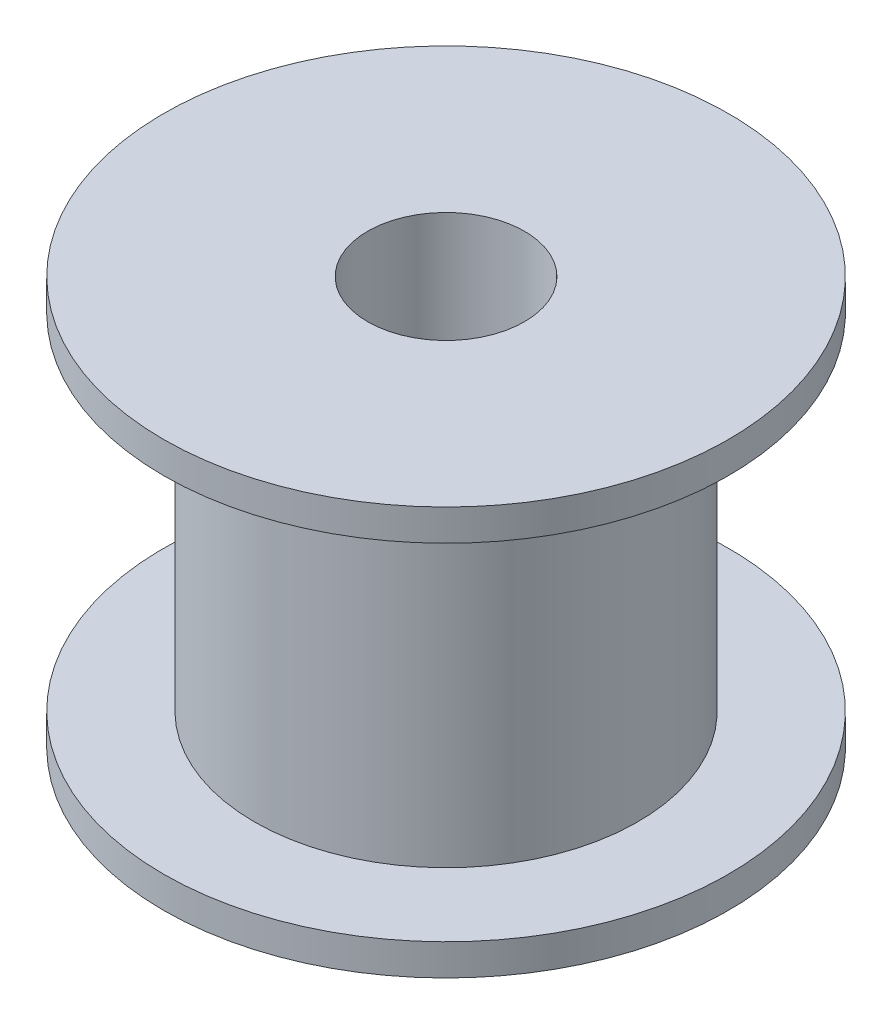
ISO-10303-21;
HEADER;
FILE_DESCRIPTION(('STEP AP214'),'2;1');
FILE_NAME('part.step','',(''),(''),'','','');
FILE_SCHEMA(('AUTOMOTIVE_DESIGN { 1 0 10303 214 1 1 1 1 }'));
ENDSEC;
DATA;
#1=APPLICATION_CONTEXT('core data for automotive mechanical design processes');
#2=APPLICATION_PROTOCOL_DEFINITION('international standard','automotive_design',2000,#1);
#3=PRODUCT_CONTEXT('',#1,'mechanical');
#4=PRODUCT('Part','Part','',(#3));
#5=PRODUCT_RELATED_PRODUCT_CATEGORY('part','',(#4));
#6=PRODUCT_DEFINITION_FORMATION('','',#4);
#7=PRODUCT_DEFINITION_CONTEXT('part definition',#1,'design');
#8=PRODUCT_DEFINITION('design','',#6,#7);
#9=PRODUCT_DEFINITION_SHAPE('','',#8);
#10=(LENGTH_UNIT() NAMED_UNIT(*) SI_UNIT(.MILLI.,.METRE.));
#11=(NAMED_UNIT(*) PLANE_ANGLE_UNIT() SI_UNIT($,.RADIAN.));
#12=(NAMED_UNIT(*) SI_UNIT($,.STERADIAN.) SOLID_ANGLE_UNIT());
#13=UNCERTAINTY_MEASURE_WITH_UNIT(LENGTH_MEASURE(1.E-05),#10,'distance_accuracy_value','');
#14=(GEOMETRIC_REPRESENTATION_CONTEXT(3) GLOBAL_UNCERTAINTY_ASSIGNED_CONTEXT((#13)) GLOBAL_UNIT_ASSIGNED_CONTEXT((#10,
#11,#12)) REPRESENTATION_CONTEXT('',''));
#15=CARTESIAN_POINT('',(0.,0.,0.));
#16=DIRECTION('',(0.,0.,1.));
#17=DIRECTION('',(1.,0.,0.));
#18=AXIS2_PLACEMENT_3D('',#15,#16,#17);
#19=CARTESIAN_POINT('',(0.,1.,0.));
#20=DIRECTION('',(0.,-1.,0.));
#21=DIRECTION('',(0.,0.,-1.));
#22=AXIS2_PLACEMENT_3D('',#19,#20,#21);
#23=CYLINDRICAL_SURFACE('',#22,9.);
#24=CARTESIAN_POINT('',(0.,1.,0.));
#25=DIRECTION('',(0.,1.,0.));
#26=DIRECTION('',(0.,0.,1.));
#27=AXIS2_PLACEMENT_3D('',#24,#25,#26);
#28=CIRCLE('',#27,9.);
#29=CARTESIAN_POINT('',(0.,1.,9.));
#30=VERTEX_POINT('',#29);
#31=EDGE_CURVE('E46',#30,#30,#28,.T.);
#32=ORIENTED_EDGE('',*,*,#31,.F.);
#33=EDGE_LOOP('',(#32));
#34=FACE_BOUND('',#33,.T.);
#35=CARTESIAN_POINT('',(0.,0.,0.));
#36=DIRECTION('',(0.,1.,0.));
#37=DIRECTION('',(0.,0.,1.));
#38=AXIS2_PLACEMENT_3D('',#35,#36,#37);
#39=CIRCLE('',#38,9.);
#40=CARTESIAN_POINT('',(0.,0.,9.));
#41=VERTEX_POINT('',#40);
#42=EDGE_CURVE('E42',#41,#41,#39,.T.);
#43=ORIENTED_EDGE('',*,*,#42,.T.);
#44=EDGE_LOOP('',(#43));
#45=FACE_BOUND('',#44,.T.);
#46=ADVANCED_FACE('F39',(#34,#45),#23,.T.);
#47=CARTESIAN_POINT('',(0.,1.,0.));
#48=DIRECTION('',(0.,1.,0.));
#49=DIRECTION('',(0.,0.,1.));
#50=AXIS2_PLACEMENT_3D('',#47,#48,#49);
#51=PLANE('',#50);
#52=CARTESIAN_POINT('',(0.,1.,0.));
#53=DIRECTION('',(0.,1.,0.));
#54=DIRECTION('',(0.,0.,1.));
#55=AXIS2_PLACEMENT_3D('',#52,#53,#54);
#56=CIRCLE('',#55,6.11);
#57=CARTESIAN_POINT('',(0.,1.,6.11));
#58=VERTEX_POINT('',#57);
#59=EDGE_CURVE('E10',#58,#58,#56,.T.);
#60=ORIENTED_EDGE('',*,*,#59,.F.);
#61=EDGE_LOOP('',(#60));
#62=FACE_BOUND('',#61,.T.);
#63=ORIENTED_EDGE('',*,*,#31,.T.);
#64=EDGE_LOOP('',(#63));
#65=FACE_BOUND('',#64,.T.);
#66=ADVANCED_FACE('F98',(#62,#65),#51,.T.);
#67=CARTESIAN_POINT('',(0.,0.,0.));
#68=DIRECTION('',(0.,1.,0.));
#69=DIRECTION('',(0.,0.,1.));
#70=AXIS2_PLACEMENT_3D('',#67,#68,#69);
#71=PLANE('',#70);
#72=CARTESIAN_POINT('',(0.,0.,0.));
#73=DIRECTION('',(0.,1.,0.));
#74=DIRECTION('',(0.,0.,1.));
#75=AXIS2_PLACEMENT_3D('',#72,#73,#74);
#76=CIRCLE('',#75,2.5);
#77=CARTESIAN_POINT('',(0.,0.,2.5));
#78=VERTEX_POINT('',#77);
#79=EDGE_CURVE('E59',#78,#78,#76,.T.);
#80=ORIENTED_EDGE('',*,*,#79,.T.);
#81=EDGE_LOOP('',(#80));
#82=FACE_BOUND('',#81,.T.);
#83=ORIENTED_EDGE('',*,*,#42,.F.);
#84=EDGE_LOOP('',(#83));
#85=FACE_BOUND('',#84,.T.);
#86=ADVANCED_FACE('F68',(#82,#85),#71,.F.);
#87=CARTESIAN_POINT('',(0.,12.,0.));
#88=DIRECTION('',(0.,-1.,0.));
#89=DIRECTION('',(0.,0.,-1.));
#90=AXIS2_PLACEMENT_3D('',#87,#88,#89);
#91=CYLINDRICAL_SURFACE('',#90,6.11);
#92=CARTESIAN_POINT('',(0.,12.,0.));
#93=DIRECTION('',(0.,1.,0.));
#94=DIRECTION('',(0.,0.,1.));
#95=AXIS2_PLACEMENT_3D('',#92,#93,#94);
#96=CIRCLE('',#95,6.11);
#97=CARTESIAN_POINT('',(0.,12.,6.11));
#98=VERTEX_POINT('',#97);
#99=EDGE_CURVE('E52',#98,#98,#96,.T.);
#100=ORIENTED_EDGE('',*,*,#99,.F.);
#101=EDGE_LOOP('',(#100));
#102=FACE_BOUND('',#101,.T.);
#103=ORIENTED_EDGE('',*,*,#59,.T.);
#104=EDGE_LOOP('',(#103));
#105=FACE_BOUND('',#104,.T.);
#106=ADVANCED_FACE('F87',(#102,#105),#91,.T.);
#107=CARTESIAN_POINT('',(0.,13.,0.));
#108=DIRECTION('',(0.,-1.,0.));
#109=DIRECTION('',(0.,0.,-1.));
#110=AXIS2_PLACEMENT_3D('',#107,#108,#109);
#111=CYLINDRICAL_SURFACE('',#110,9.);
#112=CARTESIAN_POINT('',(0.,13.,0.));
#113=DIRECTION('',(0.,1.,0.));
#114=DIRECTION('',(0.,0.,1.));
#115=AXIS2_PLACEMENT_3D('',#112,#113,#114);
#116=CIRCLE('',#115,9.);
#117=CARTESIAN_POINT('',(0.,13.,9.));
#118=VERTEX_POINT('',#117);
#119=EDGE_CURVE('E55',#118,#118,#116,.T.);
#120=ORIENTED_EDGE('',*,*,#119,.F.);
#121=EDGE_LOOP('',(#120));
#122=FACE_BOUND('',#121,.T.);
#123=CARTESIAN_POINT('',(0.,12.,0.));
#124=DIRECTION('',(0.,1.,0.));
#125=DIRECTION('',(0.,0.,1.));
#126=AXIS2_PLACEMENT_3D('',#123,#124,#125);
#127=CIRCLE('',#126,9.);
#128=CARTESIAN_POINT('',(0.,12.,9.));
#129=VERTEX_POINT('',#128);
#130=EDGE_CURVE('E56',#129,#129,#127,.T.);
#131=ORIENTED_EDGE('',*,*,#130,.T.);
#132=EDGE_LOOP('',(#131));
#133=FACE_BOUND('',#132,.T.);
#134=ADVANCED_FACE('F81',(#122,#133),#111,.T.);
#135=CARTESIAN_POINT('',(0.,13.,0.));
#136=DIRECTION('',(0.,1.,0.));
#137=DIRECTION('',(0.,0.,1.));
#138=AXIS2_PLACEMENT_3D('',#135,#136,#137);
#139=PLANE('',#138);
#140=CARTESIAN_POINT('',(0.,13.,0.));
#141=DIRECTION('',(0.,1.,0.));
#142=DIRECTION('',(0.,0.,1.));
#143=AXIS2_PLACEMENT_3D('',#140,#141,#142);
#144=CIRCLE('',#143,2.5);
#145=CARTESIAN_POINT('',(0.,13.,2.5));
#146=VERTEX_POINT('',#145);
#147=EDGE_CURVE('E62',#146,#146,#144,.T.);
#148=ORIENTED_EDGE('',*,*,#147,.F.);
#149=EDGE_LOOP('',(#148));
#150=FACE_BOUND('',#149,.T.);
#151=ORIENTED_EDGE('',*,*,#119,.T.);
#152=EDGE_LOOP('',(#151));
#153=FACE_BOUND('',#152,.T.);
#154=ADVANCED_FACE('F78',(#150,#153),#139,.T.);
#155=CARTESIAN_POINT('',(0.,12.,0.));
#156=DIRECTION('',(0.,1.,0.));
#157=DIRECTION('',(0.,0.,1.));
#158=AXIS2_PLACEMENT_3D('',#155,#156,#157);
#159=PLANE('',#158);
#160=ORIENTED_EDGE('',*,*,#99,.T.);
#161=EDGE_LOOP('',(#160));
#162=FACE_BOUND('',#161,.T.);
#163=ORIENTED_EDGE('',*,*,#130,.F.);
#164=EDGE_LOOP('',(#163));
#165=FACE_BOUND('',#164,.T.);
#166=ADVANCED_FACE('F74',(#162,#165),#159,.F.);
#167=CARTESIAN_POINT('',(0.,0.,0.));
#168=DIRECTION('',(0.,1.,0.));
#169=DIRECTION('',(0.,0.,1.));
#170=AXIS2_PLACEMENT_3D('',#167,#168,#169);
#171=CYLINDRICAL_SURFACE('',#170,2.5);
#172=CARTESIAN_POINT('',(0.,0.,2.5));
#173=CARTESIAN_POINT('',(0.,0.135416666666663,2.5));
#174=CARTESIAN_POINT('',(0.,0.27083333333333,2.5));
#175=CARTESIAN_POINT('',(0.,0.541666666666663,2.5));
#176=CARTESIAN_POINT('',(0.,0.67708333333333,2.5));
#177=CARTESIAN_POINT('',(0.,0.947916666666663,2.5));
#178=CARTESIAN_POINT('',(0.,1.08333333333333,2.5));
#179=CARTESIAN_POINT('',(0.,1.35416666666666,2.5));
#180=CARTESIAN_POINT('',(0.,1.48958333333333,2.5));
#181=CARTESIAN_POINT('',(0.,1.76041666666666,2.5));
#182=CARTESIAN_POINT('',(0.,1.89583333333333,2.5));
#183=CARTESIAN_POINT('',(0.,2.16666666666666,2.5));
#184=CARTESIAN_POINT('',(0.,2.30208333333333,2.5));
#185=CARTESIAN_POINT('',(0.,2.57291666666666,2.5));
#186=CARTESIAN_POINT('',(0.,2.70833333333333,2.5));
#187=CARTESIAN_POINT('',(0.,2.97916666666666,2.5));
#188=CARTESIAN_POINT('',(0.,3.11458333333333,2.5));
#189=CARTESIAN_POINT('',(0.,3.38541666666666,2.5));
#190=CARTESIAN_POINT('',(0.,3.52083333333333,2.5));
#191=CARTESIAN_POINT('',(0.,3.79166666666666,2.5));
#192=CARTESIAN_POINT('',(0.,3.92708333333333,2.5));
#193=CARTESIAN_POINT('',(0.,4.19791666666666,2.5));
#194=CARTESIAN_POINT('',(0.,4.33333333333333,2.5));
#195=CARTESIAN_POINT('',(0.,4.60416666666666,2.5));
#196=CARTESIAN_POINT('',(0.,4.73958333333333,2.5));
#197=CARTESIAN_POINT('',(0.,5.01041666666666,2.5));
#198=CARTESIAN_POINT('',(0.,5.14583333333333,2.5));
#199=CARTESIAN_POINT('',(0.,5.41666666666666,2.5));
#200=CARTESIAN_POINT('',(0.,5.55208333333333,2.5));
#201=CARTESIAN_POINT('',(0.,5.82291666666666,2.5));
#202=CARTESIAN_POINT('',(0.,5.95833333333333,2.5));
#203=CARTESIAN_POINT('',(0.,6.22916666666666,2.5));
#204=CARTESIAN_POINT('',(0.,6.36458333333333,2.5));
#205=CARTESIAN_POINT('',(0.,6.63541666666666,2.5));
#206=CARTESIAN_POINT('',(0.,6.77083333333333,2.5));
#207=CARTESIAN_POINT('',(0.,7.04166666666667,2.5));
#208=CARTESIAN_POINT('',(0.,7.17708333333333,2.5));
#209=CARTESIAN_POINT('',(0.,7.44791666666667,2.5));
#210=CARTESIAN_POINT('',(0.,7.58333333333333,2.5));
#211=CARTESIAN_POINT('',(0.,7.85416666666667,2.5));
#212=CARTESIAN_POINT('',(0.,7.98958333333333,2.5));
#213=CARTESIAN_POINT('',(0.,8.26041666666666,2.5));
#214=CARTESIAN_POINT('',(0.,8.39583333333333,2.5));
#215=CARTESIAN_POINT('',(0.,8.66666666666666,2.5));
#216=CARTESIAN_POINT('',(0.,8.80208333333333,2.5));
#217=CARTESIAN_POINT('',(0.,9.07291666666666,2.5));
#218=CARTESIAN_POINT('',(0.,9.20833333333333,2.5));
#219=CARTESIAN_POINT('',(0.,9.47916666666667,2.5));
#220=CARTESIAN_POINT('',(0.,9.61458333333333,2.5));
#221=CARTESIAN_POINT('',(0.,9.88541666666667,2.5));
#222=CARTESIAN_POINT('',(0.,10.0208333333333,2.5));
#223=CARTESIAN_POINT('',(0.,10.2916666666667,2.5));
#224=CARTESIAN_POINT('',(0.,10.4270833333333,2.5));
#225=CARTESIAN_POINT('',(0.,10.6979166666667,2.5));
#226=CARTESIAN_POINT('',(0.,10.8333333333333,2.5));
#227=CARTESIAN_POINT('',(0.,11.1041666666667,2.5));
#228=CARTESIAN_POINT('',(0.,11.2395833333333,2.5));
#229=CARTESIAN_POINT('',(0.,11.5104166666667,2.5));
#230=CARTESIAN_POINT('',(0.,11.6458333333333,2.5));
#231=CARTESIAN_POINT('',(0.,11.9166666666667,2.5));
#232=CARTESIAN_POINT('',(0.,12.0520833333333,2.5));
#233=CARTESIAN_POINT('',(0.,12.3229166666667,2.5));
#234=CARTESIAN_POINT('',(0.,12.4583333333333,2.5));
#235=CARTESIAN_POINT('',(0.,12.7291666666667,2.5));
#236=CARTESIAN_POINT('',(0.,12.8645833333333,2.5));
#237=CARTESIAN_POINT('',(0.,13.,2.5));
#238=B_SPLINE_CURVE_WITH_KNOTS('',3,(#172,#173,#174,#175,#176,#177,#178,#179,#180,#181,#182,
#183,#184,#185,#186,#187,#188,#189,#190,#191,#192,#193,#194,#195,#196,#197,#198,#199,#200,#201,
#202,#203,#204,#205,#206,#207,#208,#209,#210,#211,#212,#213,#214,#215,#216,#217,#218,#219,#220,
#221,#222,#223,#224,#225,#226,#227,#228,#229,#230,#231,#232,#233,#234,#235,#236,#237),
.UNSPECIFIED.,.F.,.F.,(4,2,2,2,2,2,2,2,2,2,2,2,2,2,2,2,2,2,2,2,2,2,2,2,2,2,2,2,2,2,2,2,4),(0.,
0.40625,0.8125,1.21875,1.625,2.03125,2.4375,2.84375,3.25,3.65625,4.0625,4.46875,4.875,5.28125,
5.6875,6.09375,6.5,6.90625,7.3125,7.71875,8.125,8.53125,8.9375,9.34375,9.75,10.15625,10.5625,
10.96875,11.375,11.78125,12.1875,12.59375,13.),.UNSPECIFIED.);
#239=EDGE_CURVE('BSEAM71',#78,#146,#238,.T.);
#240=ORIENTED_EDGE('',*,*,#79,.F.);
#241=ORIENTED_EDGE('',*,*,#147,.T.);
#242=ORIENTED_EDGE('',*,*,#239,.T.);
#243=ORIENTED_EDGE('',*,*,#239,.F.);
#244=EDGE_LOOP('',(#240,#242,#241,#243));
#245=FACE_BOUND('',#244,.T.);
#246=ADVANCED_FACE('F71',(#245),#171,.F.);
#247=CLOSED_SHELL('',(#46,#66,#86,#106,#134,#154,#166,#246));
#248=MANIFOLD_SOLID_BREP('B2',#247);
#249=ADVANCED_BREP_SHAPE_REPRESENTATION('',(#18,#248),#14);
#250=SHAPE_DEFINITION_REPRESENTATION(#9,#249);
ENDSEC;
END-ISO-10303-21;
